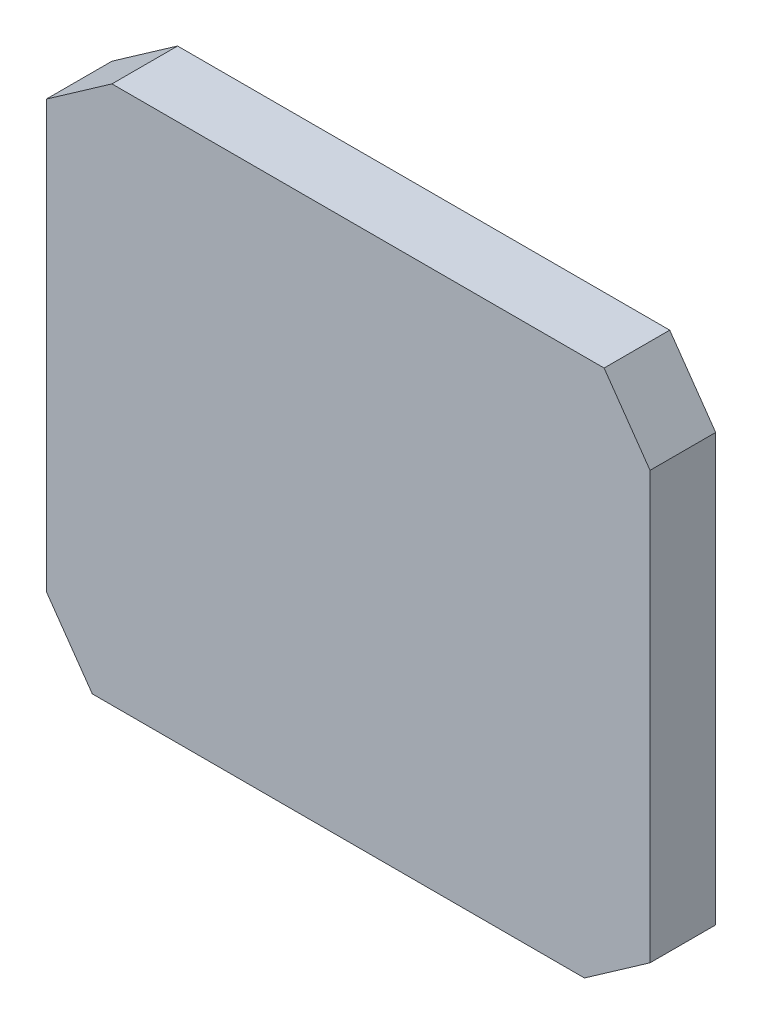
ISO-10303-21;
HEADER;
FILE_DESCRIPTION(('STEP AP214'),'2;1');
FILE_NAME('part.step','',(''),(''),'','','');
FILE_SCHEMA(('AUTOMOTIVE_DESIGN { 1 0 10303 214 1 1 1 1 }'));
ENDSEC;
DATA;
#1=APPLICATION_CONTEXT('core data for automotive mechanical design processes');
#2=APPLICATION_PROTOCOL_DEFINITION('international standard','automotive_design',2000,#1);
#3=PRODUCT_CONTEXT('',#1,'mechanical');
#4=PRODUCT('Part','Part','',(#3));
#5=PRODUCT_RELATED_PRODUCT_CATEGORY('part','',(#4));
#6=PRODUCT_DEFINITION_FORMATION('','',#4);
#7=PRODUCT_DEFINITION_CONTEXT('part definition',#1,'design');
#8=PRODUCT_DEFINITION('design','',#6,#7);
#9=PRODUCT_DEFINITION_SHAPE('','',#8);
#10=(LENGTH_UNIT() NAMED_UNIT(*) SI_UNIT(.MILLI.,.METRE.));
#11=(NAMED_UNIT(*) PLANE_ANGLE_UNIT() SI_UNIT($,.RADIAN.));
#12=(NAMED_UNIT(*) SI_UNIT($,.STERADIAN.) SOLID_ANGLE_UNIT());
#13=UNCERTAINTY_MEASURE_WITH_UNIT(LENGTH_MEASURE(1.E-05),#10,'distance_accuracy_value','');
#14=(GEOMETRIC_REPRESENTATION_CONTEXT(3) GLOBAL_UNCERTAINTY_ASSIGNED_CONTEXT((#13)) GLOBAL_UNIT_ASSIGNED_CONTEXT((#10,
#11,#12)) REPRESENTATION_CONTEXT('',''));
#15=CARTESIAN_POINT('',(0.,0.,0.));
#16=DIRECTION('',(0.,0.,1.));
#17=DIRECTION('',(1.,0.,0.));
#18=AXIS2_PLACEMENT_3D('',#15,#16,#17);
#19=CARTESIAN_POINT('',(92.,82.,20.));
#20=DIRECTION('',(-1.,0.,0.));
#21=DIRECTION('',(0.,-1.,0.));
#22=AXIS2_PLACEMENT_3D('',#19,#20,#21);
#23=PLANE('',#22);
#24=DIRECTION('',(0.,1.,0.));
#25=VECTOR('',#24,1.);
#26=CARTESIAN_POINT('',(92.,82.,20.));
#27=LINE('',#26,#25);
#28=CARTESIAN_POINT('',(92.,-67.9958492358058,20.));
#29=VERTEX_POINT('',#28);
#30=CARTESIAN_POINT('',(92.,61.9999999999999,20.));
#31=VERTEX_POINT('',#30);
#32=EDGE_CURVE('E121',#29,#31,#27,.T.);
#33=ORIENTED_EDGE('',*,*,#32,.F.);
#34=DIRECTION('',(0.,0.,-1.));
#35=VECTOR('',#34,1.);
#36=CARTESIAN_POINT('',(92.,-67.9958492358058,20.));
#37=LINE('',#36,#35);
#38=CARTESIAN_POINT('',(92.,-67.9958492358058,0.));
#39=VERTEX_POINT('',#38);
#40=EDGE_CURVE('E106',#29,#39,#37,.T.);
#41=ORIENTED_EDGE('',*,*,#40,.T.);
#42=DIRECTION('',(0.,1.,0.));
#43=VECTOR('',#42,1.);
#44=CARTESIAN_POINT('',(92.,82.,0.));
#45=LINE('',#44,#43);
#46=CARTESIAN_POINT('',(92.,61.9999999999999,0.));
#47=VERTEX_POINT('',#46);
#48=EDGE_CURVE('E118',#39,#47,#45,.T.);
#49=ORIENTED_EDGE('',*,*,#48,.T.);
#50=DIRECTION('',(0.,0.,1.));
#51=VECTOR('',#50,1.);
#52=CARTESIAN_POINT('',(92.,61.9999999999999,20.));
#53=LINE('',#52,#51);
#54=EDGE_CURVE('E123',#47,#31,#53,.T.);
#55=ORIENTED_EDGE('',*,*,#54,.T.);
#56=EDGE_LOOP('',(#33,#41,#49,#55));
#57=FACE_BOUND('',#56,.T.);
#58=ADVANCED_FACE('F35',(#57),#23,.F.);
#59=CARTESIAN_POINT('',(-92.,82.,20.));
#60=DIRECTION('',(0.,-1.,0.));
#61=DIRECTION('',(0.,0.,-1.));
#62=AXIS2_PLACEMENT_3D('',#59,#60,#61);
#63=PLANE('',#62);
#64=DIRECTION('',(-1.,0.,0.));
#65=VECTOR('',#64,1.);
#66=CARTESIAN_POINT('',(-92.,82.,20.));
#67=LINE('',#66,#65);
#68=CARTESIAN_POINT('',(77.9958492358058,82.,20.));
#69=VERTEX_POINT('',#68);
#70=CARTESIAN_POINT('',(-71.9999999999999,82.,20.));
#71=VERTEX_POINT('',#70);
#72=EDGE_CURVE('E161',#69,#71,#67,.T.);
#73=ORIENTED_EDGE('',*,*,#72,.F.);
#74=DIRECTION('',(0.,0.,-1.));
#75=VECTOR('',#74,1.);
#76=CARTESIAN_POINT('',(77.9958492358058,82.,20.));
#77=LINE('',#76,#75);
#78=CARTESIAN_POINT('',(77.9958492358058,82.,0.));
#79=VERTEX_POINT('',#78);
#80=EDGE_CURVE('E11',#69,#79,#77,.T.);
#81=ORIENTED_EDGE('',*,*,#80,.T.);
#82=DIRECTION('',(-1.,0.,0.));
#83=VECTOR('',#82,1.);
#84=CARTESIAN_POINT('',(-92.,82.,0.));
#85=LINE('',#84,#83);
#86=CARTESIAN_POINT('',(-71.9999999999999,82.,0.));
#87=VERTEX_POINT('',#86);
#88=EDGE_CURVE('E128',#79,#87,#85,.T.);
#89=ORIENTED_EDGE('',*,*,#88,.T.);
#90=DIRECTION('',(0.,0.,1.));
#91=VECTOR('',#90,1.);
#92=CARTESIAN_POINT('',(-71.9999999999999,82.,20.));
#93=LINE('',#92,#91);
#94=EDGE_CURVE('E43',#87,#71,#93,.T.);
#95=ORIENTED_EDGE('',*,*,#94,.T.);
#96=EDGE_LOOP('',(#73,#81,#89,#95));
#97=FACE_BOUND('',#96,.T.);
#98=ADVANCED_FACE('F160',(#97),#63,.F.);
#99=CARTESIAN_POINT('',(-92.,82.,20.));
#100=DIRECTION('',(1.,0.,0.));
#101=DIRECTION('',(0.,1.,0.));
#102=AXIS2_PLACEMENT_3D('',#99,#100,#101);
#103=PLANE('',#102);
#104=DIRECTION('',(0.,-1.,0.));
#105=VECTOR('',#104,1.);
#106=CARTESIAN_POINT('',(-92.,82.,0.));
#107=LINE('',#106,#105);
#108=CARTESIAN_POINT('',(-92.,67.9958492358058,0.));
#109=VERTEX_POINT('',#108);
#110=CARTESIAN_POINT('',(-92.,-61.9999999999999,0.));
#111=VERTEX_POINT('',#110);
#112=EDGE_CURVE('E131',#109,#111,#107,.T.);
#113=ORIENTED_EDGE('',*,*,#112,.T.);
#114=DIRECTION('',(0.,0.,1.));
#115=VECTOR('',#114,1.);
#116=CARTESIAN_POINT('',(-92.,-61.9999999999999,20.));
#117=LINE('',#116,#115);
#118=CARTESIAN_POINT('',(-92.,-61.9999999999999,20.));
#119=VERTEX_POINT('',#118);
#120=EDGE_CURVE('E50',#111,#119,#117,.T.);
#121=ORIENTED_EDGE('',*,*,#120,.T.);
#122=DIRECTION('',(0.,-1.,0.));
#123=VECTOR('',#122,1.);
#124=CARTESIAN_POINT('',(-92.,82.,20.));
#125=LINE('',#124,#123);
#126=CARTESIAN_POINT('',(-92.,67.9958492358058,20.));
#127=VERTEX_POINT('',#126);
#128=EDGE_CURVE('E167',#127,#119,#125,.T.);
#129=ORIENTED_EDGE('',*,*,#128,.F.);
#130=DIRECTION('',(0.,0.,-1.));
#131=VECTOR('',#130,1.);
#132=CARTESIAN_POINT('',(-92.,67.9958492358058,20.));
#133=LINE('',#132,#131);
#134=EDGE_CURVE('E154',#127,#109,#133,.T.);
#135=ORIENTED_EDGE('',*,*,#134,.T.);
#136=EDGE_LOOP('',(#113,#121,#129,#135));
#137=FACE_BOUND('',#136,.T.);
#138=ADVANCED_FACE('F171',(#137),#103,.F.);
#139=CARTESIAN_POINT('',(-92.,-82.,20.));
#140=DIRECTION('',(0.,1.,0.));
#141=DIRECTION('',(0.,0.,1.));
#142=AXIS2_PLACEMENT_3D('',#139,#140,#141);
#143=PLANE('',#142);
#144=DIRECTION('',(1.,0.,0.));
#145=VECTOR('',#144,1.);
#146=CARTESIAN_POINT('',(-92.,-82.,0.));
#147=LINE('',#146,#145);
#148=CARTESIAN_POINT('',(-77.9958492358058,-82.,0.));
#149=VERTEX_POINT('',#148);
#150=CARTESIAN_POINT('',(71.9999999999999,-82.,0.));
#151=VERTEX_POINT('',#150);
#152=EDGE_CURVE('E138',#149,#151,#147,.T.);
#153=ORIENTED_EDGE('',*,*,#152,.T.);
#154=DIRECTION('',(0.,0.,1.));
#155=VECTOR('',#154,1.);
#156=CARTESIAN_POINT('',(71.9999999999999,-82.,20.));
#157=LINE('',#156,#155);
#158=CARTESIAN_POINT('',(71.9999999999999,-82.,20.));
#159=VERTEX_POINT('',#158);
#160=EDGE_CURVE('E107',#151,#159,#157,.T.);
#161=ORIENTED_EDGE('',*,*,#160,.T.);
#162=DIRECTION('',(1.,0.,0.));
#163=VECTOR('',#162,1.);
#164=CARTESIAN_POINT('',(-92.,-82.,20.));
#165=LINE('',#164,#163);
#166=CARTESIAN_POINT('',(-77.9958492358058,-82.,20.));
#167=VERTEX_POINT('',#166);
#168=EDGE_CURVE('E134',#167,#159,#165,.T.);
#169=ORIENTED_EDGE('',*,*,#168,.F.);
#170=DIRECTION('',(0.,0.,-1.));
#171=VECTOR('',#170,1.);
#172=CARTESIAN_POINT('',(-77.9958492358058,-82.,20.));
#173=LINE('',#172,#171);
#174=EDGE_CURVE('E112',#167,#149,#173,.T.);
#175=ORIENTED_EDGE('',*,*,#174,.T.);
#176=EDGE_LOOP('',(#153,#161,#169,#175));
#177=FACE_BOUND('',#176,.T.);
#178=ADVANCED_FACE('F178',(#177),#143,.F.);
#179=CARTESIAN_POINT('',(0.,0.,20.));
#180=DIRECTION('',(0.,0.,1.));
#181=DIRECTION('',(1.,0.,0.));
#182=AXIS2_PLACEMENT_3D('',#179,#180,#181);
#183=PLANE('',#182);
#184=ORIENTED_EDGE('',*,*,#168,.T.);
#185=DIRECTION('',(-0.819152044288993,-0.573576436351045,0.));
#186=VECTOR('',#185,1.);
#187=CARTESIAN_POINT('',(62.214672292498,-88.8517602246451,20.));
#188=LINE('',#187,#186);
#189=EDGE_CURVE('E152',#159,#29,#188,.F.);
#190=ORIENTED_EDGE('',*,*,#189,.T.);
#191=ORIENTED_EDGE('',*,*,#32,.T.);
#192=DIRECTION('',(0.573576436351045,-0.819152044288993,0.));
#193=VECTOR('',#192,1.);
#194=CARTESIAN_POINT('',(90.863397837344,63.6232361130559,20.));
#195=LINE('',#194,#193);
#196=EDGE_CURVE('E148',#31,#69,#195,.F.);
#197=ORIENTED_EDGE('',*,*,#196,.T.);
#198=ORIENTED_EDGE('',*,*,#72,.T.);
#199=DIRECTION('',(0.819152044288993,0.573576436351045,0.));
#200=VECTOR('',#199,1.);
#201=CARTESIAN_POINT('',(-62.214672292498,88.8517602246451,20.));
#202=LINE('',#201,#200);
#203=EDGE_CURVE('E57',#71,#127,#202,.F.);
#204=ORIENTED_EDGE('',*,*,#203,.T.);
#205=ORIENTED_EDGE('',*,*,#128,.T.);
#206=DIRECTION('',(-0.573576436351045,0.819152044288993,0.));
#207=VECTOR('',#206,1.);
#208=CARTESIAN_POINT('',(-90.863397837344,-63.6232361130559,20.));
#209=LINE('',#208,#207);
#210=EDGE_CURVE('E150',#119,#167,#209,.F.);
#211=ORIENTED_EDGE('',*,*,#210,.T.);
#212=EDGE_LOOP('',(#184,#190,#191,#197,#198,#204,#205,#211));
#213=FACE_BOUND('',#212,.T.);
#214=ADVANCED_FACE('F165',(#213),#183,.T.);
#215=CARTESIAN_POINT('',(0.,0.,0.));
#216=DIRECTION('',(0.,0.,1.));
#217=DIRECTION('',(1.,0.,0.));
#218=AXIS2_PLACEMENT_3D('',#215,#216,#217);
#219=PLANE('',#218);
#220=ORIENTED_EDGE('',*,*,#48,.F.);
#221=DIRECTION('',(0.819152044288993,0.573576436351045,0.));
#222=VECTOR('',#221,1.);
#223=CARTESIAN_POINT('',(92.,-67.9958492358058,0.));
#224=LINE('',#223,#222);
#225=EDGE_CURVE('E102',#39,#151,#224,.F.);
#226=ORIENTED_EDGE('',*,*,#225,.T.);
#227=ORIENTED_EDGE('',*,*,#152,.F.);
#228=DIRECTION('',(0.573576436351045,-0.819152044288993,0.));
#229=VECTOR('',#228,1.);
#230=CARTESIAN_POINT('',(-77.9958492358058,-82.,0.));
#231=LINE('',#230,#229);
#232=EDGE_CURVE('E113',#149,#111,#231,.F.);
#233=ORIENTED_EDGE('',*,*,#232,.T.);
#234=ORIENTED_EDGE('',*,*,#112,.F.);
#235=DIRECTION('',(-0.819152044288993,-0.573576436351045,0.));
#236=VECTOR('',#235,1.);
#237=CARTESIAN_POINT('',(-92.,67.9958492358058,0.));
#238=LINE('',#237,#236);
#239=EDGE_CURVE('E122',#109,#87,#238,.F.);
#240=ORIENTED_EDGE('',*,*,#239,.T.);
#241=ORIENTED_EDGE('',*,*,#88,.F.);
#242=DIRECTION('',(-0.573576436351045,0.819152044288993,0.));
#243=VECTOR('',#242,1.);
#244=CARTESIAN_POINT('',(77.9958492358058,82.,0.));
#245=LINE('',#244,#243);
#246=EDGE_CURVE('E127',#79,#47,#245,.F.);
#247=ORIENTED_EDGE('',*,*,#246,.T.);
#248=EDGE_LOOP('',(#220,#226,#227,#233,#234,#240,#241,#247));
#249=FACE_BOUND('',#248,.T.);
#250=ADVANCED_FACE('F125',(#249),#219,.F.);
#251=CARTESIAN_POINT('',(92.,-67.9958492358058,20.));
#252=DIRECTION('',(-0.573576436351045,0.819152044288992,0.));
#253=DIRECTION('',(0.,0.,-1.));
#254=AXIS2_PLACEMENT_3D('',#251,#252,#253);
#255=PLANE('',#254);
#256=ORIENTED_EDGE('',*,*,#189,.F.);
#257=ORIENTED_EDGE('',*,*,#160,.F.);
#258=ORIENTED_EDGE('',*,*,#225,.F.);
#259=ORIENTED_EDGE('',*,*,#40,.F.);
#260=EDGE_LOOP('',(#256,#257,#258,#259));
#261=FACE_BOUND('',#260,.T.);
#262=ADVANCED_FACE('F105',(#261),#255,.F.);
#263=CARTESIAN_POINT('',(-77.9958492358058,-82.,20.));
#264=DIRECTION('',(0.819152044288993,0.573576436351045,0.));
#265=DIRECTION('',(0.,0.,-1.));
#266=AXIS2_PLACEMENT_3D('',#263,#264,#265);
#267=PLANE('',#266);
#268=ORIENTED_EDGE('',*,*,#210,.F.);
#269=ORIENTED_EDGE('',*,*,#120,.F.);
#270=ORIENTED_EDGE('',*,*,#232,.F.);
#271=ORIENTED_EDGE('',*,*,#174,.F.);
#272=EDGE_LOOP('',(#268,#269,#270,#271));
#273=FACE_BOUND('',#272,.T.);
#274=ADVANCED_FACE('F175',(#273),#267,.F.);
#275=CARTESIAN_POINT('',(77.9958492358058,82.,20.));
#276=DIRECTION('',(-0.819152044288993,-0.573576436351045,0.));
#277=DIRECTION('',(0.,0.,-1.));
#278=AXIS2_PLACEMENT_3D('',#275,#276,#277);
#279=PLANE('',#278);
#280=ORIENTED_EDGE('',*,*,#196,.F.);
#281=ORIENTED_EDGE('',*,*,#54,.F.);
#282=ORIENTED_EDGE('',*,*,#246,.F.);
#283=ORIENTED_EDGE('',*,*,#80,.F.);
#284=EDGE_LOOP('',(#280,#281,#282,#283));
#285=FACE_BOUND('',#284,.T.);
#286=ADVANCED_FACE('F181',(#285),#279,.F.);
#287=CARTESIAN_POINT('',(-92.,67.9958492358058,20.));
#288=DIRECTION('',(0.573576436351045,-0.819152044288992,0.));
#289=DIRECTION('',(0.,0.,-1.));
#290=AXIS2_PLACEMENT_3D('',#287,#288,#289);
#291=PLANE('',#290);
#292=ORIENTED_EDGE('',*,*,#203,.F.);
#293=ORIENTED_EDGE('',*,*,#94,.F.);
#294=ORIENTED_EDGE('',*,*,#239,.F.);
#295=ORIENTED_EDGE('',*,*,#134,.F.);
#296=EDGE_LOOP('',(#292,#293,#294,#295));
#297=FACE_BOUND('',#296,.T.);
#298=ADVANCED_FACE('F37',(#297),#291,.F.);
#299=CLOSED_SHELL('',(#58,#98,#138,#178,#214,#250,#262,#274,#286,#298));
#300=MANIFOLD_SOLID_BREP('B2',#299);
#301=ADVANCED_BREP_SHAPE_REPRESENTATION('',(#18,#300),#14);
#302=SHAPE_DEFINITION_REPRESENTATION(#9,#301);
ENDSEC;
END-ISO-10303-21;
